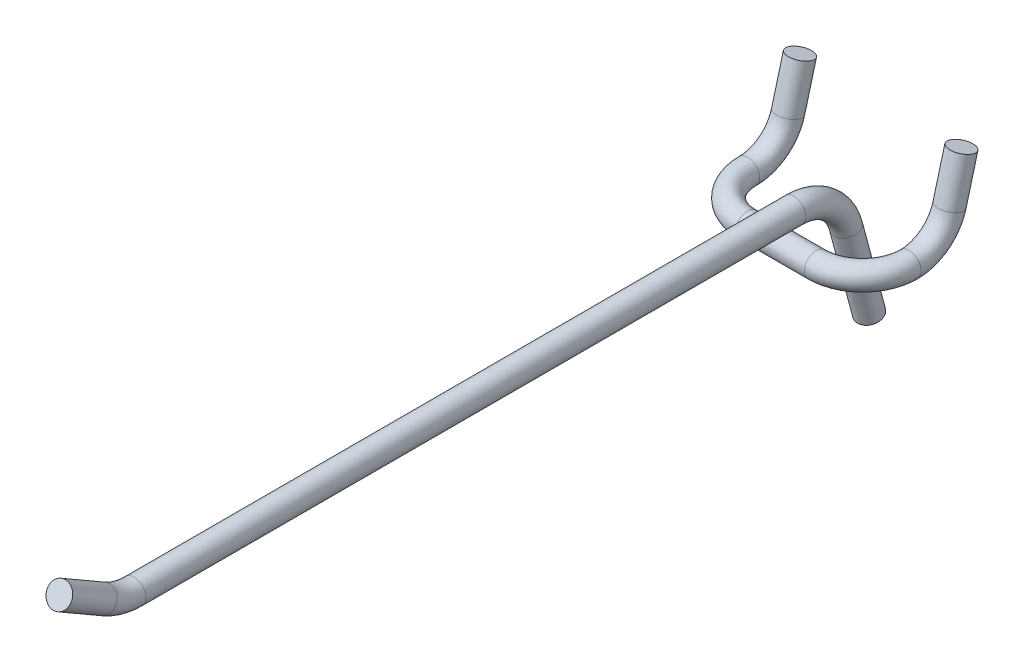
ISO-10303-21;
HEADER;
FILE_DESCRIPTION(('STEP AP214'),'2;1');
FILE_NAME('part.step','',(''),(''),'','','');
FILE_SCHEMA(('AUTOMOTIVE_DESIGN { 1 0 10303 214 1 1 1 1 }'));
ENDSEC;
DATA;
#1=APPLICATION_CONTEXT('core data for automotive mechanical design processes');
#2=APPLICATION_PROTOCOL_DEFINITION('international standard','automotive_design',2000,#1);
#3=PRODUCT_CONTEXT('',#1,'mechanical');
#4=PRODUCT('Part','Part','',(#3));
#5=PRODUCT_RELATED_PRODUCT_CATEGORY('part','',(#4));
#6=PRODUCT_DEFINITION_FORMATION('','',#4);
#7=PRODUCT_DEFINITION_CONTEXT('part definition',#1,'design');
#8=PRODUCT_DEFINITION('design','',#6,#7);
#9=PRODUCT_DEFINITION_SHAPE('','',#8);
#10=(LENGTH_UNIT() NAMED_UNIT(*) SI_UNIT(.MILLI.,.METRE.));
#11=(NAMED_UNIT(*) PLANE_ANGLE_UNIT() SI_UNIT($,.RADIAN.));
#12=(NAMED_UNIT(*) SI_UNIT($,.STERADIAN.) SOLID_ANGLE_UNIT());
#13=UNCERTAINTY_MEASURE_WITH_UNIT(LENGTH_MEASURE(1.E-05),#10,'distance_accuracy_value','');
#14=(GEOMETRIC_REPRESENTATION_CONTEXT(3) GLOBAL_UNCERTAINTY_ASSIGNED_CONTEXT((#13)) GLOBAL_UNIT_ASSIGNED_CONTEXT((#10,
#11,#12)) REPRESENTATION_CONTEXT('',''));
#15=CARTESIAN_POINT('',(0.,0.,0.));
#16=DIRECTION('',(0.,0.,1.));
#17=DIRECTION('',(1.,0.,0.));
#18=AXIS2_PLACEMENT_3D('',#15,#16,#17);
#19=CARTESIAN_POINT('',(-12.7,10.00125,-65.5654335011109));
#20=DIRECTION('',(0.,0.965925826289068,-0.258819045102521));
#21=DIRECTION('',(0.,-0.258819045102521,-0.965925826289068));
#22=AXIS2_PLACEMENT_3D('',#19,#20,#21);
#23=PLANE('',#22);
#24=CARTESIAN_POINT('',(-12.7,10.00125,-65.5654335011109));
#25=DIRECTION('',(0.,0.965925826289068,-0.258819045102521));
#26=DIRECTION('',(0.,-0.258819045102521,-0.965925826289068));
#27=AXIS2_PLACEMENT_3D('',#24,#25,#26);
#28=CIRCLE('',#27,1.8796);
#29=CARTESIAN_POINT('',(-12.7,9.51477372282531,-67.3809876842038));
#30=VERTEX_POINT('',#29);
#31=EDGE_CURVE('E75',#30,#30,#28,.T.);
#32=ORIENTED_EDGE('',*,*,#31,.T.);
#33=EDGE_LOOP('',(#32));
#34=FACE_BOUND('',#33,.T.);
#35=ADVANCED_FACE('F63',(#34),#23,.T.);
#36=CARTESIAN_POINT('',(12.7,10.00125,-65.5654335011109));
#37=DIRECTION('',(0.,-0.96592582628907,0.258819045102515));
#38=DIRECTION('',(0.,-0.258819045102515,-0.96592582628907));
#39=AXIS2_PLACEMENT_3D('',#36,#37,#38);
#40=PLANE('',#39);
#41=CARTESIAN_POINT('',(12.7,10.00125,-65.5654335011109));
#42=DIRECTION('',(0.,-0.96592582628907,0.258819045102515));
#43=DIRECTION('',(0.,-0.258819045102515,-0.96592582628907));
#44=AXIS2_PLACEMENT_3D('',#41,#42,#43);
#45=CIRCLE('',#44,1.8796);
#46=CARTESIAN_POINT('',(12.7,9.51477372282531,-67.3809876842038));
#47=VERTEX_POINT('',#46);
#48=EDGE_CURVE('E13',#47,#47,#45,.T.);
#49=ORIENTED_EDGE('',*,*,#48,.F.);
#50=EDGE_LOOP('',(#49));
#51=FACE_BOUND('',#50,.T.);
#52=ADVANCED_FACE('F81',(#51),#40,.F.);
#53=CARTESIAN_POINT('',(-12.7,10.00125,-65.5654335011109));
#54=DIRECTION('',(0.,-0.965925826289069,0.258819045102518));
#55=DIRECTION('',(0.,-0.258819045102518,-0.965925826289069));
#56=AXIS2_PLACEMENT_3D('',#53,#54,#55);
#57=CYLINDRICAL_SURFACE('',#56,1.8796);
#58=CARTESIAN_POINT('',(-12.7,2.99633302988858,-63.6884716559225));
#59=DIRECTION('',(0.,0.965925826289068,-0.258819045102521));
#60=DIRECTION('',(0.,-0.258819045102521,-0.965925826289068));
#61=AXIS2_PLACEMENT_3D('',#58,#59,#60);
#62=CIRCLE('',#61,1.8796);
#63=CARTESIAN_POINT('',(-12.7,2.50985675271389,-65.5040258390154));
#64=VERTEX_POINT('',#63);
#65=EDGE_CURVE('E123',#64,#64,#62,.T.);
#66=ORIENTED_EDGE('',*,*,#65,.T.);
#67=EDGE_LOOP('',(#66));
#68=FACE_BOUND('',#67,.T.);
#69=ORIENTED_EDGE('',*,*,#31,.F.);
#70=EDGE_LOOP('',(#69));
#71=FACE_BOUND('',#70,.T.);
#72=ADVANCED_FACE('F83',(#68,#71),#57,.T.);
#73=CARTESIAN_POINT('',(-12.7,4.699,-57.3340320150972));
#74=DIRECTION('',(-1.,0.,0.));
#75=DIRECTION('',(0.,0.,1.));
#76=AXIS2_PLACEMENT_3D('',#73,#74,#75);
#77=TOROIDAL_SURFACE('',#76,6.5786,1.8796);
#78=CARTESIAN_POINT('',(-12.7,-1.8796,-57.3340320150972));
#79=DIRECTION('',(0.,0.,-1.));
#80=DIRECTION('',(0.,-1.,0.));
#81=AXIS2_PLACEMENT_3D('',#78,#79,#80);
#82=CIRCLE('',#81,1.8796);
#83=CARTESIAN_POINT('',(-12.7,-3.7592,-57.3340320150972));
#84=VERTEX_POINT('',#83);
#85=EDGE_CURVE('E120',#84,#84,#82,.T.);
#86=CARTESIAN_POINT('',(-12.7,4.699,-57.3340320150972));
#87=DIRECTION('',(-1.,0.,0.));
#88=DIRECTION('',(0.,0.,1.));
#89=AXIS2_PLACEMENT_3D('',#86,#87,#88);
#90=CIRCLE('',#89,8.4582);
#91=EDGE_CURVE('',#64,#84,#90,.T.);
#92=ORIENTED_EDGE('',*,*,#65,.F.);
#93=ORIENTED_EDGE('',*,*,#85,.T.);
#94=ORIENTED_EDGE('',*,*,#91,.T.);
#95=ORIENTED_EDGE('',*,*,#91,.F.);
#96=EDGE_LOOP('',(#92,#94,#93,#95));
#97=FACE_BOUND('',#96,.T.);
#98=ADVANCED_FACE('F88',(#97),#77,.T.);
#99=CARTESIAN_POINT('',(-5.3959344837919,-1.8796,-57.3340320150972));
#100=DIRECTION('',(0.,1.,0.));
#101=DIRECTION('',(0.,0.,1.));
#102=AXIS2_PLACEMENT_3D('',#99,#100,#101);
#103=TOROIDAL_SURFACE('',#102,7.3040655162081,1.8796);
#104=CARTESIAN_POINT('',(-5.3959344837919,-1.8796,-50.0299664988891));
#105=DIRECTION('',(-1.,0.,0.));
#106=DIRECTION('',(0.,-1.,0.));
#107=AXIS2_PLACEMENT_3D('',#104,#105,#106);
#108=CIRCLE('',#107,1.8796);
#109=CARTESIAN_POINT('',(-5.39593448379189,-3.7592,-50.0299664988891));
#110=VERTEX_POINT('',#109);
#111=EDGE_CURVE('E125',#110,#110,#108,.T.);
#112=ORIENTED_EDGE('',*,*,#111,.T.);
#113=EDGE_LOOP('',(#112));
#114=FACE_BOUND('',#113,.T.);
#115=ORIENTED_EDGE('',*,*,#85,.F.);
#116=EDGE_LOOP('',(#115));
#117=FACE_BOUND('',#116,.T.);
#118=ADVANCED_FACE('F108',(#114,#117),#103,.T.);
#119=CARTESIAN_POINT('',(-5.3959344837919,-1.8796,-50.0299664988891));
#120=DIRECTION('',(1.,0.,0.));
#121=DIRECTION('',(0.,0.,-1.));
#122=AXIS2_PLACEMENT_3D('',#119,#120,#121);
#123=CYLINDRICAL_SURFACE('',#122,1.8796);
#124=CARTESIAN_POINT('',(5.3959344837919,-1.8796,-50.0299664988891));
#125=DIRECTION('',(-1.,0.,0.));
#126=DIRECTION('',(0.,-1.,0.));
#127=AXIS2_PLACEMENT_3D('',#124,#125,#126);
#128=CIRCLE('',#127,1.8796);
#129=CARTESIAN_POINT('',(5.3959344837919,-1.8796,-48.1503664988891));
#130=VERTEX_POINT('',#129);
#131=EDGE_CURVE('E131',#130,#130,#128,.T.);
#132=ORIENTED_EDGE('',*,*,#131,.T.);
#133=EDGE_LOOP('',(#132));
#134=FACE_BOUND('',#133,.T.);
#135=ORIENTED_EDGE('',*,*,#111,.F.);
#136=EDGE_LOOP('',(#135));
#137=FACE_BOUND('',#136,.T.);
#138=ADVANCED_FACE('F104',(#134,#137),#123,.T.);
#139=CARTESIAN_POINT('',(5.3959344837919,-1.8796,-57.3340320150972));
#140=DIRECTION('',(0.,1.,0.));
#141=DIRECTION('',(0.,0.,1.));
#142=AXIS2_PLACEMENT_3D('',#139,#140,#141);
#143=TOROIDAL_SURFACE('',#142,7.3040655162081,1.8796);
#144=CARTESIAN_POINT('',(12.7,-1.8796,-57.3340320150972));
#145=DIRECTION('',(0.,0.,1.));
#146=DIRECTION('',(0.,-1.,0.));
#147=AXIS2_PLACEMENT_3D('',#144,#145,#146);
#148=CIRCLE('',#147,1.8796);
#149=CARTESIAN_POINT('',(14.5796,-1.87959999999999,-57.3340320150972));
#150=VERTEX_POINT('',#149);
#151=EDGE_CURVE('E134',#150,#150,#148,.T.);
#152=CARTESIAN_POINT('',(5.3959344837919,-1.8796,-57.3340320150972));
#153=DIRECTION('',(0.,1.,0.));
#154=DIRECTION('',(0.,0.,1.));
#155=AXIS2_PLACEMENT_3D('',#152,#153,#154);
#156=CIRCLE('',#155,9.1836655162081);
#157=EDGE_CURVE('',#130,#150,#156,.T.);
#158=ORIENTED_EDGE('',*,*,#131,.F.);
#159=ORIENTED_EDGE('',*,*,#151,.T.);
#160=ORIENTED_EDGE('',*,*,#157,.T.);
#161=ORIENTED_EDGE('',*,*,#157,.F.);
#162=EDGE_LOOP('',(#158,#160,#159,#161));
#163=FACE_BOUND('',#162,.T.);
#164=ADVANCED_FACE('F98',(#163),#143,.T.);
#165=CARTESIAN_POINT('',(12.7,4.699,-57.3340320150972));
#166=DIRECTION('',(1.,0.,0.));
#167=DIRECTION('',(0.,0.,-1.));
#168=AXIS2_PLACEMENT_3D('',#165,#166,#167);
#169=TOROIDAL_SURFACE('',#168,6.5786,1.8796);
#170=CARTESIAN_POINT('',(12.7,2.99633302988858,-63.6884716559225));
#171=DIRECTION('',(0.,-0.96592582628907,0.258819045102515));
#172=DIRECTION('',(0.,-0.258819045102515,-0.96592582628907));
#173=AXIS2_PLACEMENT_3D('',#170,#171,#172);
#174=CIRCLE('',#173,1.8796);
#175=CARTESIAN_POINT('',(12.7,2.50985675271389,-65.5040258390154));
#176=VERTEX_POINT('',#175);
#177=EDGE_CURVE('E70',#176,#176,#174,.T.);
#178=ORIENTED_EDGE('',*,*,#177,.T.);
#179=EDGE_LOOP('',(#178));
#180=FACE_BOUND('',#179,.T.);
#181=ORIENTED_EDGE('',*,*,#151,.F.);
#182=EDGE_LOOP('',(#181));
#183=FACE_BOUND('',#182,.T.);
#184=ADVANCED_FACE('F94',(#180,#183),#169,.T.);
#185=CARTESIAN_POINT('',(12.7,2.99633302988857,-63.6884716559225));
#186=DIRECTION('',(0.,0.965925826289069,-0.258819045102518));
#187=DIRECTION('',(0.,0.258819045102518,0.965925826289069));
#188=AXIS2_PLACEMENT_3D('',#185,#186,#187);
#189=CYLINDRICAL_SURFACE('',#188,1.8796);
#190=ORIENTED_EDGE('',*,*,#48,.T.);
#191=EDGE_LOOP('',(#190));
#192=FACE_BOUND('',#191,.T.);
#193=ORIENTED_EDGE('',*,*,#177,.F.);
#194=EDGE_LOOP('',(#193));
#195=FACE_BOUND('',#194,.T.);
#196=ADVANCED_FACE('F78',(#192,#195),#189,.T.);
#197=CLOSED_SHELL('',(#35,#52,#72,#98,#118,#138,#164,#184,#196));
#198=MANIFOLD_SOLID_BREP('B2',#197);
#199=CARTESIAN_POINT('',(0.,-18.0872737228253,-63.749879318018));
#200=DIRECTION('',(0.,-0.96592582628907,-0.258819045102516));
#201=DIRECTION('',(0.,0.258819045102516,-0.96592582628907));
#202=AXIS2_PLACEMENT_3D('',#199,#200,#201);
#203=PLANE('',#202);
#204=CARTESIAN_POINT('',(0.,-18.0872737228253,-63.749879318018));
#205=DIRECTION('',(0.,-0.96592582628907,-0.258819045102516));
#206=DIRECTION('',(0.,0.258819045102516,-0.96592582628907));
#207=AXIS2_PLACEMENT_3D('',#204,#205,#206);
#208=CIRCLE('',#207,1.87960000000001);
#209=CARTESIAN_POINT('',(0.,-17.6007974456506,-65.5654335011109));
#210=VERTEX_POINT('',#209);
#211=EDGE_CURVE('E208',#210,#210,#208,.T.);
#212=ORIENTED_EDGE('',*,*,#211,.T.);
#213=EDGE_LOOP('',(#212));
#214=FACE_BOUND('',#213,.T.);
#215=ADVANCED_FACE('F196',(#214),#203,.T.);
#216=CARTESIAN_POINT('',(0.,7.19976140133625,63.6697664988891));
#217=DIRECTION('',(0.,-0.499999999999996,-0.866025403784441));
#218=DIRECTION('',(0.,0.866025403784441,-0.499999999999996));
#219=AXIS2_PLACEMENT_3D('',#216,#217,#218);
#220=PLANE('',#219);
#221=CARTESIAN_POINT('',(0.,7.19976140133625,63.6697664988891));
#222=DIRECTION('',(0.,-0.499999999999996,-0.866025403784441));
#223=DIRECTION('',(0.,0.866025403784441,-0.499999999999996));
#224=AXIS2_PLACEMENT_3D('',#221,#222,#223);
#225=CIRCLE('',#224,1.87960000000001);
#226=CARTESIAN_POINT('',(0.,8.8275427502895,62.7299664988891));
#227=VERTEX_POINT('',#226);
#228=EDGE_CURVE('E61',#227,#227,#225,.T.);
#229=ORIENTED_EDGE('',*,*,#228,.F.);
#230=EDGE_LOOP('',(#229));
#231=FACE_BOUND('',#230,.T.);
#232=ADVANCED_FACE('F214',(#231),#220,.F.);
#233=CARTESIAN_POINT('',(0.,-18.0872737228253,-63.749879318018));
#234=DIRECTION('',(0.,0.965925826289069,0.258819045102517));
#235=DIRECTION('',(0.,-0.258819045102517,0.965925826289069));
#236=AXIS2_PLACEMENT_3D('',#233,#234,#235);
#237=CYLINDRICAL_SURFACE('',#236,1.87960000000001);
#238=CARTESIAN_POINT('',(0.,-4.3894567527139,-60.0795603228073));
#239=DIRECTION('',(0.,-0.96592582628907,-0.258819045102516));
#240=DIRECTION('',(0.,0.258819045102516,-0.96592582628907));
#241=AXIS2_PLACEMENT_3D('',#238,#239,#240);
#242=CIRCLE('',#241,1.87960000000001);
#243=CARTESIAN_POINT('',(0.,-3.90298047553922,-61.8951145059003));
#244=VERTEX_POINT('',#243);
#245=EDGE_CURVE('E248',#244,#244,#242,.T.);
#246=ORIENTED_EDGE('',*,*,#245,.T.);
#247=EDGE_LOOP('',(#246));
#248=FACE_BOUND('',#247,.T.);
#249=ORIENTED_EDGE('',*,*,#211,.F.);
#250=EDGE_LOOP('',(#249));
#251=FACE_BOUND('',#250,.T.);
#252=ADVANCED_FACE('F216',(#248,#251),#237,.T.);
#253=CARTESIAN_POINT('',(0.,-6.5786,-51.9095664988891));
#254=DIRECTION('',(1.,0.,0.));
#255=DIRECTION('',(0.,0.,-1.));
#256=AXIS2_PLACEMENT_3D('',#253,#254,#255);
#257=TOROIDAL_SURFACE('',#256,8.45820000000001,1.87960000000001);
#258=CARTESIAN_POINT('',(0.,1.87960000000002,-51.9095664988891));
#259=DIRECTION('',(0.,0.,-1.));
#260=DIRECTION('',(0.,1.,0.));
#261=AXIS2_PLACEMENT_3D('',#258,#259,#260);
#262=CIRCLE('',#261,1.87960000000001);
#263=CARTESIAN_POINT('',(0.,3.75920000000001,-51.9095664988891));
#264=VERTEX_POINT('',#263);
#265=EDGE_CURVE('E245',#264,#264,#262,.T.);
#266=CARTESIAN_POINT('',(0.,-6.5786,-51.9095664988891));
#267=DIRECTION('',(1.,0.,0.));
#268=DIRECTION('',(0.,0.,-1.));
#269=AXIS2_PLACEMENT_3D('',#266,#267,#268);
#270=CIRCLE('',#269,10.3378);
#271=EDGE_CURVE('',#244,#264,#270,.T.);
#272=ORIENTED_EDGE('',*,*,#245,.F.);
#273=ORIENTED_EDGE('',*,*,#265,.T.);
#274=ORIENTED_EDGE('',*,*,#271,.T.);
#275=ORIENTED_EDGE('',*,*,#271,.F.);
#276=EDGE_LOOP('',(#272,#274,#273,#275));
#277=FACE_BOUND('',#276,.T.);
#278=ADVANCED_FACE('F221',(#277),#257,.T.);
#279=CARTESIAN_POINT('',(0.,1.87960000000003,-51.9095664988891));
#280=DIRECTION('',(0.,0.,1.));
#281=DIRECTION('',(0.,-1.,0.));
#282=AXIS2_PLACEMENT_3D('',#279,#280,#281);
#283=CYLINDRICAL_SURFACE('',#282,1.87960000000001);
#284=CARTESIAN_POINT('',(0.,1.87960000000002,51.9095664988891));
#285=DIRECTION('',(0.,0.,-1.));
#286=DIRECTION('',(0.,1.,0.));
#287=AXIS2_PLACEMENT_3D('',#284,#285,#286);
#288=CIRCLE('',#287,1.87960000000001);
#289=CARTESIAN_POINT('',(0.,0.,51.9095664988891));
#290=VERTEX_POINT('',#289);
#291=EDGE_CURVE('E250',#290,#290,#288,.T.);
#292=ORIENTED_EDGE('',*,*,#291,.T.);
#293=EDGE_LOOP('',(#292));
#294=FACE_BOUND('',#293,.T.);
#295=ORIENTED_EDGE('',*,*,#265,.F.);
#296=EDGE_LOOP('',(#295));
#297=FACE_BOUND('',#296,.T.);
#298=ADVANCED_FACE('F231',(#294,#297),#283,.T.);
#299=CARTESIAN_POINT('',(0.,11.3792,51.9095664988891));
#300=DIRECTION('',(-1.,0.,0.));
#301=DIRECTION('',(0.,0.,1.));
#302=AXIS2_PLACEMENT_3D('',#299,#300,#301);
#303=TOROIDAL_SURFACE('',#302,9.49959999999999,1.87960000000001);
#304=CARTESIAN_POINT('',(0.,3.15230507420933,56.659366498889));
#305=DIRECTION('',(0.,-0.499999999999997,-0.866025403784441));
#306=DIRECTION('',(0.,0.86602540378444,-0.499999999999997));
#307=AXIS2_PLACEMENT_3D('',#304,#305,#306);
#308=CIRCLE('',#307,1.87960000000001);
#309=CARTESIAN_POINT('',(0.,1.52452372525608,57.599166498889));
#310=VERTEX_POINT('',#309);
#311=EDGE_CURVE('E203',#310,#310,#308,.T.);
#312=CARTESIAN_POINT('',(0.,11.3792,51.9095664988891));
#313=DIRECTION('',(-1.,0.,0.));
#314=DIRECTION('',(0.,0.,1.));
#315=AXIS2_PLACEMENT_3D('',#312,#313,#314);
#316=CIRCLE('',#315,11.3792);
#317=EDGE_CURVE('',#290,#310,#316,.T.);
#318=ORIENTED_EDGE('',*,*,#291,.F.);
#319=ORIENTED_EDGE('',*,*,#311,.T.);
#320=ORIENTED_EDGE('',*,*,#317,.T.);
#321=ORIENTED_EDGE('',*,*,#317,.F.);
#322=EDGE_LOOP('',(#318,#320,#319,#321));
#323=FACE_BOUND('',#322,.T.);
#324=ADVANCED_FACE('F227',(#323),#303,.T.);
#325=CARTESIAN_POINT('',(0.,3.15230507420933,56.659366498889));
#326=DIRECTION('',(0.,0.499999999999995,0.866025403784441));
#327=DIRECTION('',(0.,-0.866025403784441,0.499999999999995));
#328=AXIS2_PLACEMENT_3D('',#325,#326,#327);
#329=CYLINDRICAL_SURFACE('',#328,1.87960000000001);
#330=ORIENTED_EDGE('',*,*,#228,.T.);
#331=EDGE_LOOP('',(#330));
#332=FACE_BOUND('',#331,.T.);
#333=ORIENTED_EDGE('',*,*,#311,.F.);
#334=EDGE_LOOP('',(#333));
#335=FACE_BOUND('',#334,.T.);
#336=ADVANCED_FACE('F211',(#332,#335),#329,.T.);
#337=CLOSED_SHELL('',(#215,#232,#252,#278,#298,#324,#336));
#338=MANIFOLD_SOLID_BREP('B7',#337);
#339=ADVANCED_BREP_SHAPE_REPRESENTATION('',(#18,#198,#338),#14);
#340=SHAPE_DEFINITION_REPRESENTATION(#9,#339);
ENDSEC;
END-ISO-10303-21;
